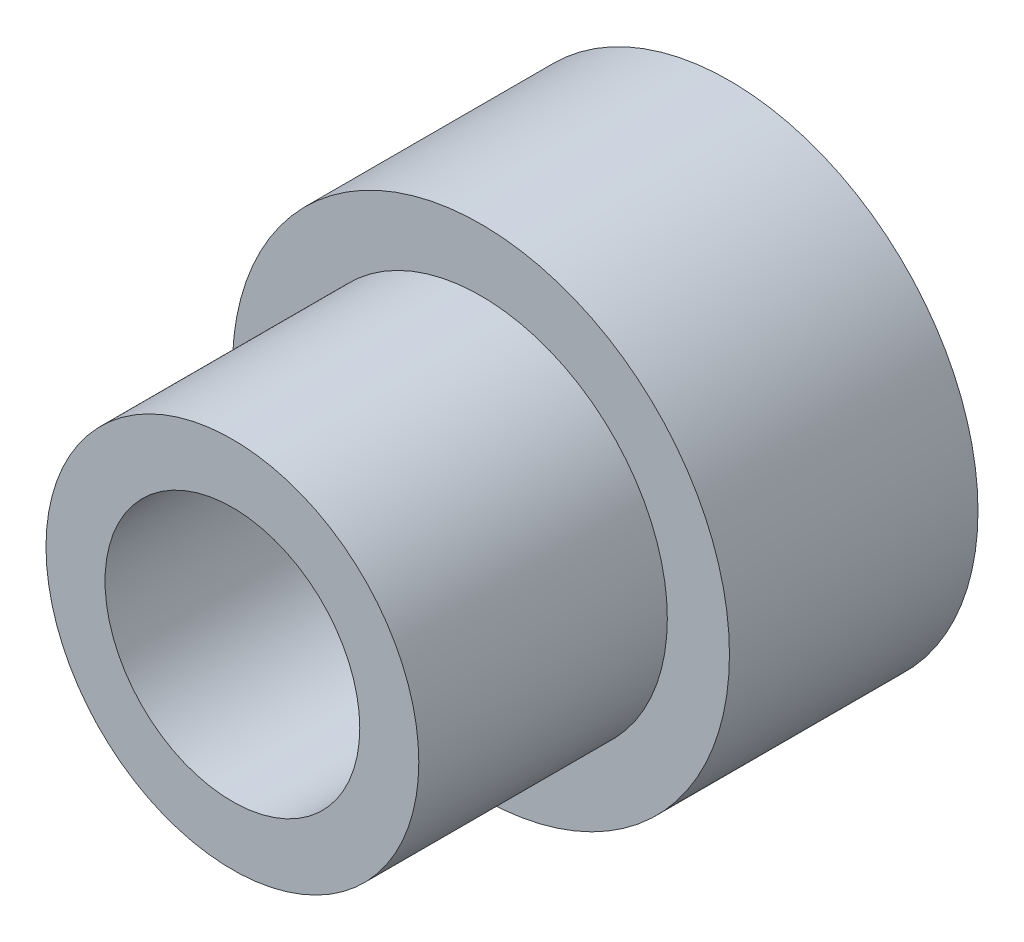
ISO-10303-21;
HEADER;
FILE_DESCRIPTION(('STEP AP214'),'2;1');
FILE_NAME('part.step','',(''),(''),'','','');
FILE_SCHEMA(('AUTOMOTIVE_DESIGN { 1 0 10303 214 1 1 1 1 }'));
ENDSEC;
DATA;
#1=APPLICATION_CONTEXT('core data for automotive mechanical design processes');
#2=APPLICATION_PROTOCOL_DEFINITION('international standard','automotive_design',2000,#1);
#3=PRODUCT_CONTEXT('',#1,'mechanical');
#4=PRODUCT('Part','Part','',(#3));
#5=PRODUCT_RELATED_PRODUCT_CATEGORY('part','',(#4));
#6=PRODUCT_DEFINITION_FORMATION('','',#4);
#7=PRODUCT_DEFINITION_CONTEXT('part definition',#1,'design');
#8=PRODUCT_DEFINITION('design','',#6,#7);
#9=PRODUCT_DEFINITION_SHAPE('','',#8);
#10=(LENGTH_UNIT() NAMED_UNIT(*) SI_UNIT(.MILLI.,.METRE.));
#11=(NAMED_UNIT(*) PLANE_ANGLE_UNIT() SI_UNIT($,.RADIAN.));
#12=(NAMED_UNIT(*) SI_UNIT($,.STERADIAN.) SOLID_ANGLE_UNIT());
#13=UNCERTAINTY_MEASURE_WITH_UNIT(LENGTH_MEASURE(1.E-05),#10,'distance_accuracy_value','');
#14=(GEOMETRIC_REPRESENTATION_CONTEXT(3) GLOBAL_UNCERTAINTY_ASSIGNED_CONTEXT((#13)) GLOBAL_UNIT_ASSIGNED_CONTEXT((#10,
#11,#12)) REPRESENTATION_CONTEXT('',''));
#15=CARTESIAN_POINT('',(0.,0.,0.));
#16=DIRECTION('',(0.,0.,1.));
#17=DIRECTION('',(1.,0.,0.));
#18=AXIS2_PLACEMENT_3D('',#15,#16,#17);
#19=CARTESIAN_POINT('',(0.,0.,2.));
#20=DIRECTION('',(0.,0.,-1.));
#21=DIRECTION('',(-1.,0.,0.));
#22=AXIS2_PLACEMENT_3D('',#19,#20,#21);
#23=CYLINDRICAL_SURFACE('',#22,2.);
#24=CARTESIAN_POINT('',(0.,0.,2.));
#25=DIRECTION('',(0.,0.,1.));
#26=DIRECTION('',(1.,0.,0.));
#27=AXIS2_PLACEMENT_3D('',#24,#25,#26);
#28=CIRCLE('',#27,2.);
#29=CARTESIAN_POINT('',(2.,0.,2.));
#30=VERTEX_POINT('',#29);
#31=EDGE_CURVE('E59',#30,#30,#28,.T.);
#32=ORIENTED_EDGE('',*,*,#31,.F.);
#33=EDGE_LOOP('',(#32));
#34=FACE_BOUND('',#33,.T.);
#35=CARTESIAN_POINT('',(0.,0.,0.));
#36=DIRECTION('',(0.,0.,1.));
#37=DIRECTION('',(1.,0.,0.));
#38=AXIS2_PLACEMENT_3D('',#35,#36,#37);
#39=CIRCLE('',#38,2.);
#40=CARTESIAN_POINT('',(2.,0.,0.));
#41=VERTEX_POINT('',#40);
#42=EDGE_CURVE('E64',#41,#41,#39,.T.);
#43=ORIENTED_EDGE('',*,*,#42,.T.);
#44=EDGE_LOOP('',(#43));
#45=FACE_BOUND('',#44,.T.);
#46=ADVANCED_FACE('F45',(#34,#45),#23,.T.);
#47=CARTESIAN_POINT('',(0.,0.,2.));
#48=DIRECTION('',(0.,0.,1.));
#49=DIRECTION('',(1.,0.,0.));
#50=AXIS2_PLACEMENT_3D('',#47,#48,#49);
#51=PLANE('',#50);
#52=CARTESIAN_POINT('',(0.,0.,2.));
#53=DIRECTION('',(0.,0.,1.));
#54=DIRECTION('',(1.,0.,0.));
#55=AXIS2_PLACEMENT_3D('',#52,#53,#54);
#56=CIRCLE('',#55,1.5);
#57=CARTESIAN_POINT('',(1.5,0.,2.));
#58=VERTEX_POINT('',#57);
#59=EDGE_CURVE('E71',#58,#58,#56,.T.);
#60=ORIENTED_EDGE('',*,*,#59,.F.);
#61=EDGE_LOOP('',(#60));
#62=FACE_BOUND('',#61,.T.);
#63=ORIENTED_EDGE('',*,*,#31,.T.);
#64=EDGE_LOOP('',(#63));
#65=FACE_BOUND('',#64,.T.);
#66=ADVANCED_FACE('F98',(#62,#65),#51,.T.);
#67=CARTESIAN_POINT('',(0.,0.,0.));
#68=DIRECTION('',(0.,0.,1.));
#69=DIRECTION('',(1.,0.,0.));
#70=AXIS2_PLACEMENT_3D('',#67,#68,#69);
#71=PLANE('',#70);
#72=ORIENTED_EDGE('',*,*,#42,.F.);
#73=EDGE_LOOP('',(#72));
#74=FACE_BOUND('',#73,.T.);
#75=ADVANCED_FACE('F88',(#74),#71,.F.);
#76=CARTESIAN_POINT('',(0.,0.,4.));
#77=DIRECTION('',(0.,0.,1.));
#78=DIRECTION('',(1.,0.,0.));
#79=AXIS2_PLACEMENT_3D('',#76,#77,#78);
#80=PLANE('',#79);
#81=CARTESIAN_POINT('',(0.,0.,4.));
#82=DIRECTION('',(0.,0.,1.));
#83=DIRECTION('',(1.,0.,0.));
#84=AXIS2_PLACEMENT_3D('',#81,#82,#83);
#85=CIRCLE('',#84,1.5);
#86=CARTESIAN_POINT('',(1.5,0.,4.));
#87=VERTEX_POINT('',#86);
#88=EDGE_CURVE('E69',#87,#87,#85,.T.);
#89=ORIENTED_EDGE('',*,*,#88,.T.);
#90=EDGE_LOOP('',(#89));
#91=FACE_BOUND('',#90,.T.);
#92=CARTESIAN_POINT('',(0.,0.,4.));
#93=DIRECTION('',(0.,0.,1.));
#94=DIRECTION('',(1.,0.,0.));
#95=AXIS2_PLACEMENT_3D('',#92,#93,#94);
#96=CIRCLE('',#95,1.025);
#97=CARTESIAN_POINT('',(1.025,0.,4.));
#98=VERTEX_POINT('',#97);
#99=EDGE_CURVE('E75',#98,#98,#96,.T.);
#100=ORIENTED_EDGE('',*,*,#99,.F.);
#101=EDGE_LOOP('',(#100));
#102=FACE_BOUND('',#101,.T.);
#103=ADVANCED_FACE('F85',(#91,#102),#80,.T.);
#104=CARTESIAN_POINT('',(0.,0.,4.));
#105=DIRECTION('',(0.,0.,-1.));
#106=DIRECTION('',(-1.,0.,0.));
#107=AXIS2_PLACEMENT_3D('',#104,#105,#106);
#108=CYLINDRICAL_SURFACE('',#107,1.5);
#109=ORIENTED_EDGE('',*,*,#88,.F.);
#110=EDGE_LOOP('',(#109));
#111=FACE_BOUND('',#110,.T.);
#112=ORIENTED_EDGE('',*,*,#59,.T.);
#113=EDGE_LOOP('',(#112));
#114=FACE_BOUND('',#113,.T.);
#115=ADVANCED_FACE('F87',(#111,#114),#108,.T.);
#116=CARTESIAN_POINT('',(0.,0.,4.));
#117=DIRECTION('',(0.,0.,-1.));
#118=DIRECTION('',(-1.,0.,0.));
#119=AXIS2_PLACEMENT_3D('',#116,#117,#118);
#120=CYLINDRICAL_SURFACE('',#119,1.025);
#121=CARTESIAN_POINT('',(0.,0.,2.2));
#122=DIRECTION('',(0.,0.,1.));
#123=DIRECTION('',(1.,0.,0.));
#124=AXIS2_PLACEMENT_3D('',#121,#122,#123);
#125=CIRCLE('',#124,1.025);
#126=CARTESIAN_POINT('',(1.025,0.,2.2));
#127=VERTEX_POINT('',#126);
#128=EDGE_CURVE('E54',#127,#127,#125,.F.);
#129=ORIENTED_EDGE('',*,*,#128,.T.);
#130=EDGE_LOOP('',(#129));
#131=FACE_BOUND('',#130,.T.);
#132=ORIENTED_EDGE('',*,*,#99,.T.);
#133=EDGE_LOOP('',(#132));
#134=FACE_BOUND('',#133,.T.);
#135=ADVANCED_FACE('F83',(#131,#134),#120,.F.);
#136=CARTESIAN_POINT('',(0.,0.,2.));
#137=DIRECTION('',(0.,0.,1.));
#138=DIRECTION('',(1.,0.,0.));
#139=AXIS2_PLACEMENT_3D('',#136,#137,#138);
#140=CIRCLE('',#139,0.825000000000002);
#141=CARTESIAN_POINT('',(0.825000000000002,0.,2.));
#142=VERTEX_POINT('',#141);
#143=EDGE_CURVE('E10',#142,#142,#140,.T.);
#144=ORIENTED_EDGE('',*,*,#143,.T.);
#145=EDGE_LOOP('',(#144));
#146=FACE_BOUND('',#145,.T.);
#147=ADVANCED_FACE('F108',(#146),#51,.T.);
#148=CARTESIAN_POINT('',(0.,0.,2.2));
#149=DIRECTION('',(0.,0.,1.));
#150=DIRECTION('',(1.,0.,0.));
#151=AXIS2_PLACEMENT_3D('',#148,#149,#150);
#152=CONICAL_SURFACE('',#151,1.025,0.785398163397441);
#153=ORIENTED_EDGE('',*,*,#143,.F.);
#154=EDGE_LOOP('',(#153));
#155=FACE_BOUND('',#154,.T.);
#156=ORIENTED_EDGE('',*,*,#128,.F.);
#157=EDGE_LOOP('',(#156));
#158=FACE_BOUND('',#157,.T.);
#159=ADVANCED_FACE('F48',(#155,#158),#152,.F.);
#160=CLOSED_SHELL('',(#46,#66,#75,#103,#115,#135,#147,#159));
#161=MANIFOLD_SOLID_BREP('B2',#160);
#162=ADVANCED_BREP_SHAPE_REPRESENTATION('',(#18,#161),#14);
#163=SHAPE_DEFINITION_REPRESENTATION(#9,#162);
ENDSEC;
END-ISO-10303-21;
